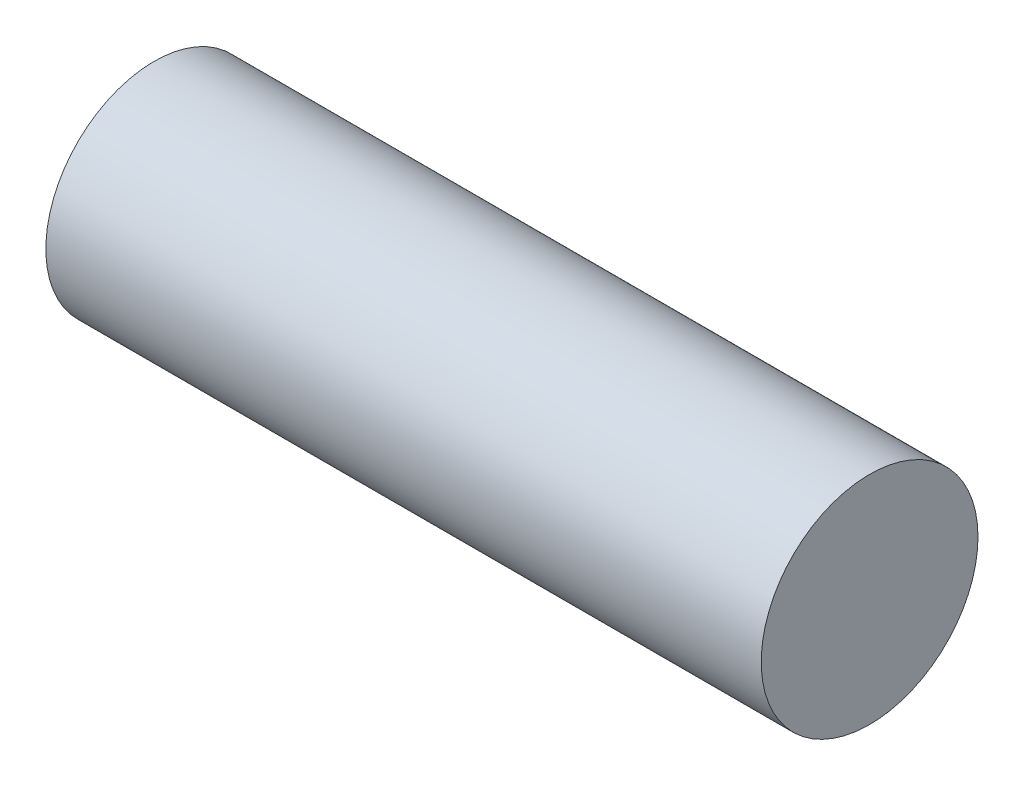
ISO-10303-21;
HEADER;
FILE_DESCRIPTION(('STEP AP214'),'2;1');
FILE_NAME('part.step','',(''),(''),'','','');
FILE_SCHEMA(('AUTOMOTIVE_DESIGN { 1 0 10303 214 1 1 1 1 }'));
ENDSEC;
DATA;
#1=APPLICATION_CONTEXT('core data for automotive mechanical design processes');
#2=APPLICATION_PROTOCOL_DEFINITION('international standard','automotive_design',2000,#1);
#3=PRODUCT_CONTEXT('',#1,'mechanical');
#4=PRODUCT('Part','Part','',(#3));
#5=PRODUCT_RELATED_PRODUCT_CATEGORY('part','',(#4));
#6=PRODUCT_DEFINITION_FORMATION('','',#4);
#7=PRODUCT_DEFINITION_CONTEXT('part definition',#1,'design');
#8=PRODUCT_DEFINITION('design','',#6,#7);
#9=PRODUCT_DEFINITION_SHAPE('','',#8);
#10=(LENGTH_UNIT() NAMED_UNIT(*) SI_UNIT(.MILLI.,.METRE.));
#11=(NAMED_UNIT(*) PLANE_ANGLE_UNIT() SI_UNIT($,.RADIAN.));
#12=(NAMED_UNIT(*) SI_UNIT($,.STERADIAN.) SOLID_ANGLE_UNIT());
#13=UNCERTAINTY_MEASURE_WITH_UNIT(LENGTH_MEASURE(1.E-05),#10,'distance_accuracy_value','');
#14=(GEOMETRIC_REPRESENTATION_CONTEXT(3) GLOBAL_UNCERTAINTY_ASSIGNED_CONTEXT((#13)) GLOBAL_UNIT_ASSIGNED_CONTEXT((#10,
#11,#12)) REPRESENTATION_CONTEXT('',''));
#15=CARTESIAN_POINT('',(0.,0.,0.));
#16=DIRECTION('',(0.,0.,1.));
#17=DIRECTION('',(1.,0.,0.));
#18=AXIS2_PLACEMENT_3D('',#15,#16,#17);
#19=CARTESIAN_POINT('',(33.,0.,0.));
#20=DIRECTION('',(-1.,0.,0.));
#21=DIRECTION('',(0.,0.,1.));
#22=AXIS2_PLACEMENT_3D('',#19,#20,#21);
#23=CYLINDRICAL_SURFACE('',#22,5.);
#24=CARTESIAN_POINT('',(33.,0.,0.));
#25=DIRECTION('',(1.,0.,0.));
#26=DIRECTION('',(0.,0.,-1.));
#27=AXIS2_PLACEMENT_3D('',#24,#25,#26);
#28=CIRCLE('',#27,5.);
#29=CARTESIAN_POINT('',(33.,0.,-5.));
#30=VERTEX_POINT('',#29);
#31=EDGE_CURVE('E10',#30,#30,#28,.T.);
#32=ORIENTED_EDGE('',*,*,#31,.F.);
#33=EDGE_LOOP('',(#32));
#34=FACE_BOUND('',#33,.T.);
#35=CARTESIAN_POINT('',(0.,0.,0.));
#36=DIRECTION('',(1.,0.,0.));
#37=DIRECTION('',(0.,0.,-1.));
#38=AXIS2_PLACEMENT_3D('',#35,#36,#37);
#39=CIRCLE('',#38,5.);
#40=CARTESIAN_POINT('',(0.,0.,-5.));
#41=VERTEX_POINT('',#40);
#42=EDGE_CURVE('E40',#41,#41,#39,.T.);
#43=ORIENTED_EDGE('',*,*,#42,.T.);
#44=EDGE_LOOP('',(#43));
#45=FACE_BOUND('',#44,.T.);
#46=ADVANCED_FACE('F37',(#34,#45),#23,.T.);
#47=CARTESIAN_POINT('',(33.,0.,0.));
#48=DIRECTION('',(1.,0.,0.));
#49=DIRECTION('',(0.,0.,-1.));
#50=AXIS2_PLACEMENT_3D('',#47,#48,#49);
#51=PLANE('',#50);
#52=ORIENTED_EDGE('',*,*,#31,.T.);
#53=EDGE_LOOP('',(#52));
#54=FACE_BOUND('',#53,.T.);
#55=ADVANCED_FACE('F54',(#54),#51,.T.);
#56=CARTESIAN_POINT('',(0.,0.,0.));
#57=DIRECTION('',(1.,0.,0.));
#58=DIRECTION('',(0.,0.,-1.));
#59=AXIS2_PLACEMENT_3D('',#56,#57,#58);
#60=PLANE('',#59);
#61=ORIENTED_EDGE('',*,*,#42,.F.);
#62=EDGE_LOOP('',(#61));
#63=FACE_BOUND('',#62,.T.);
#64=ADVANCED_FACE('F52',(#63),#60,.F.);
#65=CLOSED_SHELL('',(#46,#55,#64));
#66=MANIFOLD_SOLID_BREP('B2',#65);
#67=ADVANCED_BREP_SHAPE_REPRESENTATION('',(#18,#66),#14);
#68=SHAPE_DEFINITION_REPRESENTATION(#9,#67);
ENDSEC;
END-ISO-10303-21;
